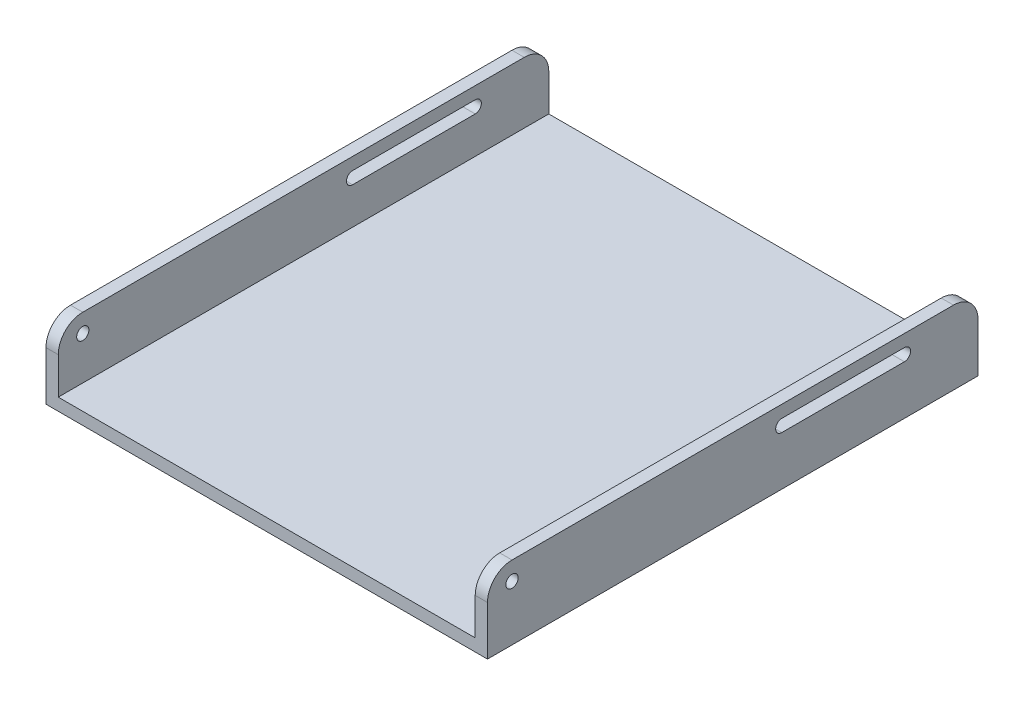
ISO-10303-21;
HEADER;
FILE_DESCRIPTION(('STEP AP214'),'2;1');
FILE_NAME('part.step','',(''),(''),'','','');
FILE_SCHEMA(('AUTOMOTIVE_DESIGN { 1 0 10303 214 1 1 1 1 }'));
ENDSEC;
DATA;
#1=APPLICATION_CONTEXT('core data for automotive mechanical design processes');
#2=APPLICATION_PROTOCOL_DEFINITION('international standard','automotive_design',2000,#1);
#3=PRODUCT_CONTEXT('',#1,'mechanical');
#4=PRODUCT('Part','Part','',(#3));
#5=PRODUCT_RELATED_PRODUCT_CATEGORY('part','',(#4));
#6=PRODUCT_DEFINITION_FORMATION('','',#4);
#7=PRODUCT_DEFINITION_CONTEXT('part definition',#1,'design');
#8=PRODUCT_DEFINITION('design','',#6,#7);
#9=PRODUCT_DEFINITION_SHAPE('','',#8);
#10=(LENGTH_UNIT() NAMED_UNIT(*) SI_UNIT(.MILLI.,.METRE.));
#11=(NAMED_UNIT(*) PLANE_ANGLE_UNIT() SI_UNIT($,.RADIAN.));
#12=(NAMED_UNIT(*) SI_UNIT($,.STERADIAN.) SOLID_ANGLE_UNIT());
#13=UNCERTAINTY_MEASURE_WITH_UNIT(LENGTH_MEASURE(1.E-05),#10,'distance_accuracy_value','');
#14=(GEOMETRIC_REPRESENTATION_CONTEXT(3) GLOBAL_UNCERTAINTY_ASSIGNED_CONTEXT((#13)) GLOBAL_UNIT_ASSIGNED_CONTEXT((#10,
#11,#12)) REPRESENTATION_CONTEXT('',''));
#15=CARTESIAN_POINT('',(0.,0.,0.));
#16=DIRECTION('',(0.,0.,1.));
#17=DIRECTION('',(1.,0.,0.));
#18=AXIS2_PLACEMENT_3D('',#15,#16,#17);
#19=CARTESIAN_POINT('',(-140.,0.,200.));
#20=DIRECTION('',(-1.,0.,0.));
#21=DIRECTION('',(0.,0.,1.));
#22=AXIS2_PLACEMENT_3D('',#19,#20,#21);
#23=PLANE('',#22);
#24=CARTESIAN_POINT('',(-140.,45.,180.));
#25=DIRECTION('',(-1.,0.,0.));
#26=DIRECTION('',(0.,0.,1.));
#27=AXIS2_PLACEMENT_3D('',#24,#25,#26);
#28=CIRCLE('',#27,4.99999999999999);
#29=CARTESIAN_POINT('',(-140.,45.,185.));
#30=VERTEX_POINT('',#29);
#31=EDGE_CURVE('E586',#30,#30,#28,.T.);
#32=ORIENTED_EDGE('',*,*,#31,.T.);
#33=EDGE_LOOP('',(#32));
#34=FACE_BOUND('',#33,.T.);
#35=DIRECTION('',(0.,0.,1.));
#36=VECTOR('',#35,1.);
#37=CARTESIAN_POINT('',(-140.,40.,200.));
#38=LINE('',#37,#36);
#39=CARTESIAN_POINT('',(-140.,40.,-140.));
#40=VERTEX_POINT('',#39);
#41=CARTESIAN_POINT('',(-140.,40.,-40.));
#42=VERTEX_POINT('',#41);
#43=EDGE_CURVE('E215',#40,#42,#38,.T.);
#44=ORIENTED_EDGE('',*,*,#43,.T.);
#45=CARTESIAN_POINT('',(-140.,45.,-40.));
#46=DIRECTION('',(-1.,0.,0.));
#47=DIRECTION('',(0.,0.,1.));
#48=AXIS2_PLACEMENT_3D('',#45,#46,#47);
#49=CIRCLE('',#48,5.);
#50=CARTESIAN_POINT('',(-140.,50.,-40.));
#51=VERTEX_POINT('',#50);
#52=EDGE_CURVE('E231',#42,#51,#49,.T.);
#53=ORIENTED_EDGE('',*,*,#52,.T.);
#54=DIRECTION('',(0.,0.,-1.));
#55=VECTOR('',#54,1.);
#56=CARTESIAN_POINT('',(-140.,50.,200.));
#57=LINE('',#56,#55);
#58=CARTESIAN_POINT('',(-140.,50.,-140.));
#59=VERTEX_POINT('',#58);
#60=EDGE_CURVE('E226',#51,#59,#57,.T.);
#61=ORIENTED_EDGE('',*,*,#60,.T.);
#62=CARTESIAN_POINT('',(-140.,45.,-140.));
#63=DIRECTION('',(-1.,0.,0.));
#64=DIRECTION('',(0.,0.,1.));
#65=AXIS2_PLACEMENT_3D('',#62,#63,#64);
#66=CIRCLE('',#65,5.);
#67=EDGE_CURVE('E221',#59,#40,#66,.T.);
#68=ORIENTED_EDGE('',*,*,#67,.T.);
#69=EDGE_LOOP('',(#44,#53,#61,#68));
#70=FACE_BOUND('',#69,.T.);
#71=DIRECTION('',(0.,0.,-1.));
#72=VECTOR('',#71,1.);
#73=CARTESIAN_POINT('',(-140.,60.,200.));
#74=LINE('',#73,#72);
#75=CARTESIAN_POINT('',(-140.,60.,180.));
#76=VERTEX_POINT('',#75);
#77=CARTESIAN_POINT('',(-140.,60.,-180.));
#78=VERTEX_POINT('',#77);
#79=EDGE_CURVE('E283',#76,#78,#74,.T.);
#80=ORIENTED_EDGE('',*,*,#79,.F.);
#81=CARTESIAN_POINT('',(-140.,40.,180.));
#82=DIRECTION('',(-1.,0.,0.));
#83=DIRECTION('',(0.,0.,1.));
#84=AXIS2_PLACEMENT_3D('',#81,#82,#83);
#85=CIRCLE('',#84,20.);
#86=CARTESIAN_POINT('',(-140.,40.,200.));
#87=VERTEX_POINT('',#86);
#88=EDGE_CURVE('E302',#76,#87,#85,.F.);
#89=ORIENTED_EDGE('',*,*,#88,.T.);
#90=DIRECTION('',(0.,1.,0.));
#91=VECTOR('',#90,1.);
#92=CARTESIAN_POINT('',(-140.,0.,200.));
#93=LINE('',#92,#91);
#94=CARTESIAN_POINT('',(-140.,10.,200.));
#95=VERTEX_POINT('',#94);
#96=EDGE_CURVE('E235',#95,#87,#93,.T.);
#97=ORIENTED_EDGE('',*,*,#96,.F.);
#98=DIRECTION('',(0.,0.,-1.));
#99=VECTOR('',#98,1.);
#100=CARTESIAN_POINT('',(-140.,10.,200.));
#101=LINE('',#100,#99);
#102=CARTESIAN_POINT('',(-140.,10.,-200.));
#103=VERTEX_POINT('',#102);
#104=EDGE_CURVE('E251',#95,#103,#101,.T.);
#105=ORIENTED_EDGE('',*,*,#104,.T.);
#106=DIRECTION('',(0.,1.,0.));
#107=VECTOR('',#106,1.);
#108=CARTESIAN_POINT('',(-140.,0.,-200.));
#109=LINE('',#108,#107);
#110=CARTESIAN_POINT('',(-140.,40.,-200.));
#111=VERTEX_POINT('',#110);
#112=EDGE_CURVE('E234',#103,#111,#109,.T.);
#113=ORIENTED_EDGE('',*,*,#112,.T.);
#114=CARTESIAN_POINT('',(-140.,40.,-180.));
#115=DIRECTION('',(-1.,0.,0.));
#116=DIRECTION('',(0.,0.,1.));
#117=AXIS2_PLACEMENT_3D('',#114,#115,#116);
#118=CIRCLE('',#117,20.);
#119=EDGE_CURVE('E300',#111,#78,#118,.F.);
#120=ORIENTED_EDGE('',*,*,#119,.T.);
#121=EDGE_LOOP('',(#80,#89,#97,#105,#113,#120));
#122=FACE_BOUND('',#121,.T.);
#123=ADVANCED_FACE('F36',(#34,#70,#122),#23,.F.);
#124=CARTESIAN_POINT('',(-150.,60.,200.));
#125=DIRECTION('',(0.,1.,0.));
#126=DIRECTION('',(0.,0.,1.));
#127=AXIS2_PLACEMENT_3D('',#124,#125,#126);
#128=PLANE('',#127);
#129=DIRECTION('',(0.,0.,-1.));
#130=VECTOR('',#129,1.);
#131=CARTESIAN_POINT('',(-150.,60.,200.));
#132=LINE('',#131,#130);
#133=CARTESIAN_POINT('',(-150.,60.,180.));
#134=VERTEX_POINT('',#133);
#135=CARTESIAN_POINT('',(-150.,60.,-180.));
#136=VERTEX_POINT('',#135);
#137=EDGE_CURVE('E280',#134,#136,#132,.T.);
#138=ORIENTED_EDGE('',*,*,#137,.F.);
#139=DIRECTION('',(1.,0.,0.));
#140=VECTOR('',#139,1.);
#141=CARTESIAN_POINT('',(-140.,60.,180.));
#142=LINE('',#141,#140);
#143=EDGE_CURVE('E297',#134,#76,#142,.T.);
#144=ORIENTED_EDGE('',*,*,#143,.T.);
#145=ORIENTED_EDGE('',*,*,#79,.T.);
#146=DIRECTION('',(1.,0.,0.));
#147=VECTOR('',#146,1.);
#148=CARTESIAN_POINT('',(-150.,60.,-180.));
#149=LINE('',#148,#147);
#150=EDGE_CURVE('E295',#78,#136,#149,.F.);
#151=ORIENTED_EDGE('',*,*,#150,.T.);
#152=EDGE_LOOP('',(#138,#144,#145,#151));
#153=FACE_BOUND('',#152,.T.);
#154=ADVANCED_FACE('F362',(#153),#128,.T.);
#155=CARTESIAN_POINT('',(-150.,0.,200.));
#156=DIRECTION('',(-1.,0.,0.));
#157=DIRECTION('',(0.,0.,1.));
#158=AXIS2_PLACEMENT_3D('',#155,#156,#157);
#159=PLANE('',#158);
#160=CARTESIAN_POINT('',(-150.,45.,180.));
#161=DIRECTION('',(-1.,0.,0.));
#162=DIRECTION('',(0.,0.,1.));
#163=AXIS2_PLACEMENT_3D('',#160,#161,#162);
#164=CIRCLE('',#163,4.99999999999999);
#165=CARTESIAN_POINT('',(-150.,45.,185.));
#166=VERTEX_POINT('',#165);
#167=EDGE_CURVE('E589',#166,#166,#164,.T.);
#168=ORIENTED_EDGE('',*,*,#167,.F.);
#169=EDGE_LOOP('',(#168));
#170=FACE_BOUND('',#169,.T.);
#171=CARTESIAN_POINT('',(-150.,45.,-40.));
#172=DIRECTION('',(-1.,0.,0.));
#173=DIRECTION('',(0.,0.,1.));
#174=AXIS2_PLACEMENT_3D('',#171,#172,#173);
#175=CIRCLE('',#174,5.);
#176=CARTESIAN_POINT('',(-150.,40.,-40.));
#177=VERTEX_POINT('',#176);
#178=CARTESIAN_POINT('',(-150.,50.,-40.));
#179=VERTEX_POINT('',#178);
#180=EDGE_CURVE('E229',#177,#179,#175,.T.);
#181=ORIENTED_EDGE('',*,*,#180,.F.);
#182=DIRECTION('',(0.,0.,1.));
#183=VECTOR('',#182,1.);
#184=CARTESIAN_POINT('',(-150.,40.,200.));
#185=LINE('',#184,#183);
#186=CARTESIAN_POINT('',(-150.,40.,-140.));
#187=VERTEX_POINT('',#186);
#188=EDGE_CURVE('E213',#187,#177,#185,.T.);
#189=ORIENTED_EDGE('',*,*,#188,.F.);
#190=CARTESIAN_POINT('',(-150.,45.,-140.));
#191=DIRECTION('',(-1.,0.,0.));
#192=DIRECTION('',(0.,0.,1.));
#193=AXIS2_PLACEMENT_3D('',#190,#191,#192);
#194=CIRCLE('',#193,5.);
#195=CARTESIAN_POINT('',(-150.,50.,-140.));
#196=VERTEX_POINT('',#195);
#197=EDGE_CURVE('E218',#196,#187,#194,.T.);
#198=ORIENTED_EDGE('',*,*,#197,.F.);
#199=DIRECTION('',(0.,0.,-1.));
#200=VECTOR('',#199,1.);
#201=CARTESIAN_POINT('',(-150.,50.,200.));
#202=LINE('',#201,#200);
#203=EDGE_CURVE('E224',#179,#196,#202,.T.);
#204=ORIENTED_EDGE('',*,*,#203,.F.);
#205=EDGE_LOOP('',(#181,#189,#198,#204));
#206=FACE_BOUND('',#205,.T.);
#207=DIRECTION('',(0.,1.,0.));
#208=VECTOR('',#207,1.);
#209=CARTESIAN_POINT('',(-150.,0.,200.));
#210=LINE('',#209,#208);
#211=CARTESIAN_POINT('',(-150.,0.,200.));
#212=VERTEX_POINT('',#211);
#213=CARTESIAN_POINT('',(-150.,40.,200.));
#214=VERTEX_POINT('',#213);
#215=EDGE_CURVE('E238',#212,#214,#210,.T.);
#216=ORIENTED_EDGE('',*,*,#215,.T.);
#217=CARTESIAN_POINT('',(-150.,40.,180.));
#218=DIRECTION('',(-1.,0.,0.));
#219=DIRECTION('',(0.,0.,1.));
#220=AXIS2_PLACEMENT_3D('',#217,#218,#219);
#221=CIRCLE('',#220,20.);
#222=EDGE_CURVE('E310',#214,#134,#221,.T.);
#223=ORIENTED_EDGE('',*,*,#222,.T.);
#224=ORIENTED_EDGE('',*,*,#137,.T.);
#225=CARTESIAN_POINT('',(-150.,40.,-180.));
#226=DIRECTION('',(-1.,0.,0.));
#227=DIRECTION('',(0.,0.,1.));
#228=AXIS2_PLACEMENT_3D('',#225,#226,#227);
#229=CIRCLE('',#228,20.);
#230=CARTESIAN_POINT('',(-150.,40.,-200.));
#231=VERTEX_POINT('',#230);
#232=EDGE_CURVE('E308',#136,#231,#229,.T.);
#233=ORIENTED_EDGE('',*,*,#232,.T.);
#234=DIRECTION('',(0.,1.,0.));
#235=VECTOR('',#234,1.);
#236=CARTESIAN_POINT('',(-150.,0.,-200.));
#237=LINE('',#236,#235);
#238=CARTESIAN_POINT('',(-150.,0.,-200.));
#239=VERTEX_POINT('',#238);
#240=EDGE_CURVE('E254',#239,#231,#237,.T.);
#241=ORIENTED_EDGE('',*,*,#240,.F.);
#242=DIRECTION('',(0.,0.,-1.));
#243=VECTOR('',#242,1.);
#244=CARTESIAN_POINT('',(-150.,0.,200.));
#245=LINE('',#244,#243);
#246=EDGE_CURVE('E278',#212,#239,#245,.T.);
#247=ORIENTED_EDGE('',*,*,#246,.F.);
#248=EDGE_LOOP('',(#216,#223,#224,#233,#241,#247));
#249=FACE_BOUND('',#248,.T.);
#250=ADVANCED_FACE('F366',(#170,#206,#249),#159,.T.);
#251=CARTESIAN_POINT('',(-150.,0.,200.));
#252=DIRECTION('',(0.,-1.,0.));
#253=DIRECTION('',(0.,0.,-1.));
#254=AXIS2_PLACEMENT_3D('',#251,#252,#253);
#255=PLANE('',#254);
#256=DIRECTION('',(-1.,0.,0.));
#257=VECTOR('',#256,1.);
#258=CARTESIAN_POINT('',(-150.,0.,-200.));
#259=LINE('',#258,#257);
#260=CARTESIAN_POINT('',(210.,0.,-200.));
#261=VERTEX_POINT('',#260);
#262=EDGE_CURVE('E257',#261,#239,#259,.T.);
#263=ORIENTED_EDGE('',*,*,#262,.F.);
#264=DIRECTION('',(0.,0.,-1.));
#265=VECTOR('',#264,1.);
#266=CARTESIAN_POINT('',(210.,0.,200.));
#267=LINE('',#266,#265);
#268=CARTESIAN_POINT('',(210.,0.,200.));
#269=VERTEX_POINT('',#268);
#270=EDGE_CURVE('E275',#269,#261,#267,.T.);
#271=ORIENTED_EDGE('',*,*,#270,.F.);
#272=DIRECTION('',(-1.,0.,0.));
#273=VECTOR('',#272,1.);
#274=CARTESIAN_POINT('',(-150.,0.,200.));
#275=LINE('',#274,#273);
#276=EDGE_CURVE('E242',#269,#212,#275,.T.);
#277=ORIENTED_EDGE('',*,*,#276,.T.);
#278=ORIENTED_EDGE('',*,*,#246,.T.);
#279=EDGE_LOOP('',(#263,#271,#277,#278));
#280=FACE_BOUND('',#279,.T.);
#281=ADVANCED_FACE('F373',(#280),#255,.T.);
#282=CARTESIAN_POINT('',(210.,0.,200.));
#283=DIRECTION('',(1.,0.,0.));
#284=DIRECTION('',(0.,0.,-1.));
#285=AXIS2_PLACEMENT_3D('',#282,#283,#284);
#286=PLANE('',#285);
#287=CARTESIAN_POINT('',(210.,45.,180.));
#288=DIRECTION('',(-1.,0.,0.));
#289=DIRECTION('',(0.,0.,1.));
#290=AXIS2_PLACEMENT_3D('',#287,#288,#289);
#291=CIRCLE('',#290,4.99999999999999);
#292=CARTESIAN_POINT('',(210.,45.,185.));
#293=VERTEX_POINT('',#292);
#294=EDGE_CURVE('E592',#293,#293,#291,.T.);
#295=ORIENTED_EDGE('',*,*,#294,.T.);
#296=EDGE_LOOP('',(#295));
#297=FACE_BOUND('',#296,.T.);
#298=CARTESIAN_POINT('',(210.,45.,-40.));
#299=DIRECTION('',(1.,0.,0.));
#300=DIRECTION('',(0.,0.,-1.));
#301=AXIS2_PLACEMENT_3D('',#298,#299,#300);
#302=CIRCLE('',#301,5.);
#303=CARTESIAN_POINT('',(210.,50.,-40.));
#304=VERTEX_POINT('',#303);
#305=CARTESIAN_POINT('',(210.,40.,-40.));
#306=VERTEX_POINT('',#305);
#307=EDGE_CURVE('E197',#304,#306,#302,.T.);
#308=ORIENTED_EDGE('',*,*,#307,.F.);
#309=DIRECTION('',(0.,0.,1.));
#310=VECTOR('',#309,1.);
#311=CARTESIAN_POINT('',(210.,50.,-40.));
#312=LINE('',#311,#310);
#313=CARTESIAN_POINT('',(210.,50.,-140.));
#314=VERTEX_POINT('',#313);
#315=EDGE_CURVE('E201',#314,#304,#312,.T.);
#316=ORIENTED_EDGE('',*,*,#315,.F.);
#317=CARTESIAN_POINT('',(210.,45.,-140.));
#318=DIRECTION('',(1.,0.,0.));
#319=DIRECTION('',(0.,0.,-1.));
#320=AXIS2_PLACEMENT_3D('',#317,#318,#319);
#321=CIRCLE('',#320,5.);
#322=CARTESIAN_POINT('',(210.,40.,-140.));
#323=VERTEX_POINT('',#322);
#324=EDGE_CURVE('E180',#323,#314,#321,.T.);
#325=ORIENTED_EDGE('',*,*,#324,.F.);
#326=DIRECTION('',(0.,0.,-1.));
#327=VECTOR('',#326,1.);
#328=CARTESIAN_POINT('',(210.,40.,-40.));
#329=LINE('',#328,#327);
#330=EDGE_CURVE('E191',#306,#323,#329,.T.);
#331=ORIENTED_EDGE('',*,*,#330,.F.);
#332=EDGE_LOOP('',(#308,#316,#325,#331));
#333=FACE_BOUND('',#332,.T.);
#334=DIRECTION('',(0.,0.,-1.));
#335=VECTOR('',#334,1.);
#336=CARTESIAN_POINT('',(210.,60.,200.));
#337=LINE('',#336,#335);
#338=CARTESIAN_POINT('',(210.,60.,180.));
#339=VERTEX_POINT('',#338);
#340=CARTESIAN_POINT('',(210.,60.,-180.));
#341=VERTEX_POINT('',#340);
#342=EDGE_CURVE('E273',#339,#341,#337,.T.);
#343=ORIENTED_EDGE('',*,*,#342,.F.);
#344=CARTESIAN_POINT('',(210.,40.,180.));
#345=DIRECTION('',(1.,0.,0.));
#346=DIRECTION('',(0.,0.,-1.));
#347=AXIS2_PLACEMENT_3D('',#344,#345,#346);
#348=CIRCLE('',#347,20.);
#349=CARTESIAN_POINT('',(210.,40.,200.));
#350=VERTEX_POINT('',#349);
#351=EDGE_CURVE('E60',#339,#350,#348,.T.);
#352=ORIENTED_EDGE('',*,*,#351,.T.);
#353=DIRECTION('',(0.,-1.,0.));
#354=VECTOR('',#353,1.);
#355=CARTESIAN_POINT('',(210.,0.,200.));
#356=LINE('',#355,#354);
#357=EDGE_CURVE('E245',#350,#269,#356,.T.);
#358=ORIENTED_EDGE('',*,*,#357,.T.);
#359=ORIENTED_EDGE('',*,*,#270,.T.);
#360=DIRECTION('',(0.,-1.,0.));
#361=VECTOR('',#360,1.);
#362=CARTESIAN_POINT('',(210.,0.,-200.));
#363=LINE('',#362,#361);
#364=CARTESIAN_POINT('',(210.,40.,-200.));
#365=VERTEX_POINT('',#364);
#366=EDGE_CURVE('E260',#365,#261,#363,.T.);
#367=ORIENTED_EDGE('',*,*,#366,.F.);
#368=CARTESIAN_POINT('',(210.,40.,-180.));
#369=DIRECTION('',(1.,0.,0.));
#370=DIRECTION('',(0.,0.,-1.));
#371=AXIS2_PLACEMENT_3D('',#368,#369,#370);
#372=CIRCLE('',#371,20.);
#373=EDGE_CURVE('E52',#365,#341,#372,.T.);
#374=ORIENTED_EDGE('',*,*,#373,.T.);
#375=EDGE_LOOP('',(#343,#352,#358,#359,#367,#374));
#376=FACE_BOUND('',#375,.T.);
#377=ADVANCED_FACE('F199',(#297,#333,#376),#286,.T.);
#378=CARTESIAN_POINT('',(200.,60.,200.));
#379=DIRECTION('',(0.,1.,0.));
#380=DIRECTION('',(0.,0.,1.));
#381=AXIS2_PLACEMENT_3D('',#378,#379,#380);
#382=PLANE('',#381);
#383=DIRECTION('',(0.,0.,-1.));
#384=VECTOR('',#383,1.);
#385=CARTESIAN_POINT('',(200.,60.,200.));
#386=LINE('',#385,#384);
#387=CARTESIAN_POINT('',(200.,60.,180.));
#388=VERTEX_POINT('',#387);
#389=CARTESIAN_POINT('',(200.,60.,-180.));
#390=VERTEX_POINT('',#389);
#391=EDGE_CURVE('E270',#388,#390,#386,.T.);
#392=ORIENTED_EDGE('',*,*,#391,.F.);
#393=DIRECTION('',(1.,0.,0.));
#394=VECTOR('',#393,1.);
#395=CARTESIAN_POINT('',(210.,60.,180.));
#396=LINE('',#395,#394);
#397=EDGE_CURVE('E320',#388,#339,#396,.T.);
#398=ORIENTED_EDGE('',*,*,#397,.T.);
#399=ORIENTED_EDGE('',*,*,#342,.T.);
#400=DIRECTION('',(1.,0.,0.));
#401=VECTOR('',#400,1.);
#402=CARTESIAN_POINT('',(200.,60.,-180.));
#403=LINE('',#402,#401);
#404=EDGE_CURVE('E318',#341,#390,#403,.F.);
#405=ORIENTED_EDGE('',*,*,#404,.T.);
#406=EDGE_LOOP('',(#392,#398,#399,#405));
#407=FACE_BOUND('',#406,.T.);
#408=ADVANCED_FACE('F339',(#407),#382,.T.);
#409=CARTESIAN_POINT('',(200.,0.,200.));
#410=DIRECTION('',(1.,0.,0.));
#411=DIRECTION('',(0.,0.,-1.));
#412=AXIS2_PLACEMENT_3D('',#409,#410,#411);
#413=PLANE('',#412);
#414=CARTESIAN_POINT('',(200.,45.,180.));
#415=DIRECTION('',(1.,0.,0.));
#416=DIRECTION('',(0.,0.,-1.));
#417=AXIS2_PLACEMENT_3D('',#414,#415,#416);
#418=CIRCLE('',#417,4.99999999999999);
#419=CARTESIAN_POINT('',(200.,45.,185.));
#420=VERTEX_POINT('',#419);
#421=EDGE_CURVE('E40',#420,#420,#418,.T.);
#422=ORIENTED_EDGE('',*,*,#421,.T.);
#423=EDGE_LOOP('',(#422));
#424=FACE_BOUND('',#423,.T.);
#425=DIRECTION('',(0.,0.,1.));
#426=VECTOR('',#425,1.);
#427=CARTESIAN_POINT('',(200.,50.,200.));
#428=LINE('',#427,#426);
#429=CARTESIAN_POINT('',(200.,50.,-140.));
#430=VERTEX_POINT('',#429);
#431=CARTESIAN_POINT('',(200.,50.,-40.));
#432=VERTEX_POINT('',#431);
#433=EDGE_CURVE('E289',#430,#432,#428,.T.);
#434=ORIENTED_EDGE('',*,*,#433,.T.);
#435=CARTESIAN_POINT('',(200.,45.,-40.));
#436=DIRECTION('',(1.,0.,0.));
#437=DIRECTION('',(0.,0.,-1.));
#438=AXIS2_PLACEMENT_3D('',#435,#436,#437);
#439=CIRCLE('',#438,5.);
#440=CARTESIAN_POINT('',(200.,40.,-40.));
#441=VERTEX_POINT('',#440);
#442=EDGE_CURVE('E292',#432,#441,#439,.T.);
#443=ORIENTED_EDGE('',*,*,#442,.T.);
#444=DIRECTION('',(0.,0.,-1.));
#445=VECTOR('',#444,1.);
#446=CARTESIAN_POINT('',(200.,40.,200.));
#447=LINE('',#446,#445);
#448=CARTESIAN_POINT('',(200.,40.,-140.));
#449=VERTEX_POINT('',#448);
#450=EDGE_CURVE('E286',#441,#449,#447,.T.);
#451=ORIENTED_EDGE('',*,*,#450,.T.);
#452=CARTESIAN_POINT('',(200.,45.,-140.));
#453=DIRECTION('',(1.,0.,0.));
#454=DIRECTION('',(0.,0.,-1.));
#455=AXIS2_PLACEMENT_3D('',#452,#453,#454);
#456=CIRCLE('',#455,5.);
#457=EDGE_CURVE('E183',#449,#430,#456,.T.);
#458=ORIENTED_EDGE('',*,*,#457,.T.);
#459=EDGE_LOOP('',(#434,#443,#451,#458));
#460=FACE_BOUND('',#459,.T.);
#461=DIRECTION('',(0.,1.,0.));
#462=VECTOR('',#461,1.);
#463=CARTESIAN_POINT('',(200.,0.,200.));
#464=LINE('',#463,#462);
#465=CARTESIAN_POINT('',(200.,40.,200.));
#466=VERTEX_POINT('',#465);
#467=CARTESIAN_POINT('',(200.,10.,200.));
#468=VERTEX_POINT('',#467);
#469=EDGE_CURVE('E247',#466,#468,#464,.F.);
#470=ORIENTED_EDGE('',*,*,#469,.F.);
#471=CARTESIAN_POINT('',(200.,40.,180.));
#472=DIRECTION('',(1.,0.,0.));
#473=DIRECTION('',(0.,0.,-1.));
#474=AXIS2_PLACEMENT_3D('',#471,#472,#473);
#475=CIRCLE('',#474,20.);
#476=EDGE_CURVE('E11',#466,#388,#475,.F.);
#477=ORIENTED_EDGE('',*,*,#476,.T.);
#478=ORIENTED_EDGE('',*,*,#391,.T.);
#479=CARTESIAN_POINT('',(200.,40.,-180.));
#480=DIRECTION('',(1.,0.,0.));
#481=DIRECTION('',(0.,0.,-1.));
#482=AXIS2_PLACEMENT_3D('',#479,#480,#481);
#483=CIRCLE('',#482,20.);
#484=CARTESIAN_POINT('',(200.,40.,-200.));
#485=VERTEX_POINT('',#484);
#486=EDGE_CURVE('E45',#390,#485,#483,.F.);
#487=ORIENTED_EDGE('',*,*,#486,.T.);
#488=DIRECTION('',(0.,1.,0.));
#489=VECTOR('',#488,1.);
#490=CARTESIAN_POINT('',(200.,0.,-200.));
#491=LINE('',#490,#489);
#492=CARTESIAN_POINT('',(200.,10.,-200.));
#493=VERTEX_POINT('',#492);
#494=EDGE_CURVE('E262',#485,#493,#491,.F.);
#495=ORIENTED_EDGE('',*,*,#494,.T.);
#496=DIRECTION('',(0.,0.,-1.));
#497=VECTOR('',#496,1.);
#498=CARTESIAN_POINT('',(200.,10.,200.));
#499=LINE('',#498,#497);
#500=EDGE_CURVE('E267',#468,#493,#499,.T.);
#501=ORIENTED_EDGE('',*,*,#500,.F.);
#502=EDGE_LOOP('',(#470,#477,#478,#487,#495,#501));
#503=FACE_BOUND('',#502,.T.);
#504=ADVANCED_FACE('F328',(#424,#460,#503),#413,.F.);
#505=CARTESIAN_POINT('',(-150.,10.,200.));
#506=DIRECTION('',(0.,-1.,0.));
#507=DIRECTION('',(0.,0.,-1.));
#508=AXIS2_PLACEMENT_3D('',#505,#506,#507);
#509=PLANE('',#508);
#510=DIRECTION('',(1.,0.,0.));
#511=VECTOR('',#510,1.);
#512=CARTESIAN_POINT('',(-150.,10.,-200.));
#513=LINE('',#512,#511);
#514=EDGE_CURVE('E239',#493,#103,#513,.F.);
#515=ORIENTED_EDGE('',*,*,#514,.T.);
#516=ORIENTED_EDGE('',*,*,#104,.F.);
#517=DIRECTION('',(1.,0.,0.));
#518=VECTOR('',#517,1.);
#519=CARTESIAN_POINT('',(-150.,10.,200.));
#520=LINE('',#519,#518);
#521=EDGE_CURVE('E249',#468,#95,#520,.F.);
#522=ORIENTED_EDGE('',*,*,#521,.F.);
#523=ORIENTED_EDGE('',*,*,#500,.T.);
#524=EDGE_LOOP('',(#515,#516,#522,#523));
#525=FACE_BOUND('',#524,.T.);
#526=ADVANCED_FACE('F353',(#525),#509,.F.);
#527=CARTESIAN_POINT('',(0.,0.,200.));
#528=DIRECTION('',(0.,0.,-1.));
#529=DIRECTION('',(-1.,0.,0.));
#530=AXIS2_PLACEMENT_3D('',#527,#528,#529);
#531=PLANE('',#530);
#532=ORIENTED_EDGE('',*,*,#96,.T.);
#533=DIRECTION('',(1.,0.,0.));
#534=VECTOR('',#533,1.);
#535=CARTESIAN_POINT('',(-150.,40.,200.));
#536=LINE('',#535,#534);
#537=EDGE_CURVE('E306',#87,#214,#536,.F.);
#538=ORIENTED_EDGE('',*,*,#537,.T.);
#539=ORIENTED_EDGE('',*,*,#215,.F.);
#540=ORIENTED_EDGE('',*,*,#276,.F.);
#541=ORIENTED_EDGE('',*,*,#357,.F.);
#542=DIRECTION('',(1.,0.,0.));
#543=VECTOR('',#542,1.);
#544=CARTESIAN_POINT('',(200.,40.,200.));
#545=LINE('',#544,#543);
#546=EDGE_CURVE('E304',#350,#466,#545,.F.);
#547=ORIENTED_EDGE('',*,*,#546,.T.);
#548=ORIENTED_EDGE('',*,*,#469,.T.);
#549=ORIENTED_EDGE('',*,*,#521,.T.);
#550=EDGE_LOOP('',(#532,#538,#539,#540,#541,#547,#548,#549));
#551=FACE_BOUND('',#550,.T.);
#552=ADVANCED_FACE('F344',(#551),#531,.F.);
#553=CARTESIAN_POINT('',(0.,0.,-200.));
#554=DIRECTION('',(0.,0.,-1.));
#555=DIRECTION('',(-1.,0.,0.));
#556=AXIS2_PLACEMENT_3D('',#553,#554,#555);
#557=PLANE('',#556);
#558=ORIENTED_EDGE('',*,*,#240,.T.);
#559=DIRECTION('',(1.,0.,0.));
#560=VECTOR('',#559,1.);
#561=CARTESIAN_POINT('',(0.,40.,-200.));
#562=LINE('',#561,#560);
#563=EDGE_CURVE('E315',#231,#111,#562,.T.);
#564=ORIENTED_EDGE('',*,*,#563,.T.);
#565=ORIENTED_EDGE('',*,*,#112,.F.);
#566=ORIENTED_EDGE('',*,*,#514,.F.);
#567=ORIENTED_EDGE('',*,*,#494,.F.);
#568=DIRECTION('',(1.,0.,0.));
#569=VECTOR('',#568,1.);
#570=CARTESIAN_POINT('',(0.,40.,-200.));
#571=LINE('',#570,#569);
#572=EDGE_CURVE('E312',#485,#365,#571,.T.);
#573=ORIENTED_EDGE('',*,*,#572,.T.);
#574=ORIENTED_EDGE('',*,*,#366,.T.);
#575=ORIENTED_EDGE('',*,*,#262,.T.);
#576=EDGE_LOOP('',(#558,#564,#565,#566,#567,#573,#574,#575));
#577=FACE_BOUND('',#576,.T.);
#578=ADVANCED_FACE('F336',(#577),#557,.T.);
#579=CARTESIAN_POINT('',(-154.,40.,-40.));
#580=DIRECTION('',(0.,-1.,0.));
#581=DIRECTION('',(0.,0.,-1.));
#582=AXIS2_PLACEMENT_3D('',#579,#580,#581);
#583=PLANE('',#582);
#584=DIRECTION('',(1.,0.,0.));
#585=VECTOR('',#584,1.);
#586=CARTESIAN_POINT('',(-154.,40.,-40.));
#587=LINE('',#586,#585);
#588=EDGE_CURVE('E194',#441,#306,#587,.T.);
#589=ORIENTED_EDGE('',*,*,#588,.T.);
#590=ORIENTED_EDGE('',*,*,#330,.T.);
#591=DIRECTION('',(1.,0.,0.));
#592=VECTOR('',#591,1.);
#593=CARTESIAN_POINT('',(-154.,40.,-140.));
#594=LINE('',#593,#592);
#595=EDGE_CURVE('E175',#449,#323,#594,.T.);
#596=ORIENTED_EDGE('',*,*,#595,.F.);
#597=ORIENTED_EDGE('',*,*,#450,.F.);
#598=EDGE_LOOP('',(#589,#590,#596,#597));
#599=FACE_BOUND('',#598,.T.);
#600=ADVANCED_FACE('F192',(#599),#583,.F.);
#601=CARTESIAN_POINT('',(-154.,45.,-140.));
#602=DIRECTION('',(1.,0.,0.));
#603=DIRECTION('',(0.,0.,-1.));
#604=AXIS2_PLACEMENT_3D('',#601,#602,#603);
#605=CYLINDRICAL_SURFACE('',#604,5.);
#606=ORIENTED_EDGE('',*,*,#595,.T.);
#607=ORIENTED_EDGE('',*,*,#324,.T.);
#608=DIRECTION('',(1.,0.,0.));
#609=VECTOR('',#608,1.);
#610=CARTESIAN_POINT('',(-154.,50.,-140.));
#611=LINE('',#610,#609);
#612=EDGE_CURVE('E210',#430,#314,#611,.T.);
#613=ORIENTED_EDGE('',*,*,#612,.F.);
#614=ORIENTED_EDGE('',*,*,#457,.F.);
#615=EDGE_LOOP('',(#606,#607,#613,#614));
#616=FACE_BOUND('',#615,.T.);
#617=ADVANCED_FACE('F177',(#616),#605,.F.);
#618=CARTESIAN_POINT('',(-154.,50.,-40.));
#619=DIRECTION('',(0.,1.,0.));
#620=DIRECTION('',(0.,0.,1.));
#621=AXIS2_PLACEMENT_3D('',#618,#619,#620);
#622=PLANE('',#621);
#623=ORIENTED_EDGE('',*,*,#612,.T.);
#624=ORIENTED_EDGE('',*,*,#315,.T.);
#625=DIRECTION('',(1.,0.,0.));
#626=VECTOR('',#625,1.);
#627=CARTESIAN_POINT('',(-154.,50.,-40.));
#628=LINE('',#627,#626);
#629=EDGE_CURVE('E206',#432,#304,#628,.T.);
#630=ORIENTED_EDGE('',*,*,#629,.F.);
#631=ORIENTED_EDGE('',*,*,#433,.F.);
#632=EDGE_LOOP('',(#623,#624,#630,#631));
#633=FACE_BOUND('',#632,.T.);
#634=ADVANCED_FACE('F422',(#633),#622,.F.);
#635=CARTESIAN_POINT('',(-154.,45.,-40.));
#636=DIRECTION('',(1.,0.,0.));
#637=DIRECTION('',(0.,0.,-1.));
#638=AXIS2_PLACEMENT_3D('',#635,#636,#637);
#639=CYLINDRICAL_SURFACE('',#638,5.);
#640=ORIENTED_EDGE('',*,*,#629,.T.);
#641=ORIENTED_EDGE('',*,*,#307,.T.);
#642=ORIENTED_EDGE('',*,*,#588,.F.);
#643=ORIENTED_EDGE('',*,*,#442,.F.);
#644=EDGE_LOOP('',(#640,#641,#642,#643));
#645=FACE_BOUND('',#644,.T.);
#646=ADVANCED_FACE('F431',(#645),#639,.F.);
#647=EDGE_CURVE('E187',#177,#42,#587,.T.);
#648=ORIENTED_EDGE('',*,*,#647,.F.);
#649=ORIENTED_EDGE('',*,*,#180,.T.);
#650=EDGE_CURVE('E208',#179,#51,#628,.T.);
#651=ORIENTED_EDGE('',*,*,#650,.T.);
#652=ORIENTED_EDGE('',*,*,#52,.F.);
#653=EDGE_LOOP('',(#648,#649,#651,#652));
#654=FACE_BOUND('',#653,.T.);
#655=ADVANCED_FACE('F420',(#654),#639,.F.);
#656=ORIENTED_EDGE('',*,*,#650,.F.);
#657=ORIENTED_EDGE('',*,*,#203,.T.);
#658=EDGE_CURVE('E209',#196,#59,#611,.T.);
#659=ORIENTED_EDGE('',*,*,#658,.T.);
#660=ORIENTED_EDGE('',*,*,#60,.F.);
#661=EDGE_LOOP('',(#656,#657,#659,#660));
#662=FACE_BOUND('',#661,.T.);
#663=ADVANCED_FACE('F416',(#662),#622,.F.);
#664=ORIENTED_EDGE('',*,*,#658,.F.);
#665=ORIENTED_EDGE('',*,*,#197,.T.);
#666=EDGE_CURVE('E186',#187,#40,#594,.T.);
#667=ORIENTED_EDGE('',*,*,#666,.T.);
#668=ORIENTED_EDGE('',*,*,#67,.F.);
#669=EDGE_LOOP('',(#664,#665,#667,#668));
#670=FACE_BOUND('',#669,.T.);
#671=ADVANCED_FACE('F419',(#670),#605,.F.);
#672=ORIENTED_EDGE('',*,*,#666,.F.);
#673=ORIENTED_EDGE('',*,*,#188,.T.);
#674=ORIENTED_EDGE('',*,*,#647,.T.);
#675=ORIENTED_EDGE('',*,*,#43,.F.);
#676=EDGE_LOOP('',(#672,#673,#674,#675));
#677=FACE_BOUND('',#676,.T.);
#678=ADVANCED_FACE('F396',(#677),#583,.F.);
#679=CARTESIAN_POINT('',(-150.,40.,180.));
#680=DIRECTION('',(-1.,0.,0.));
#681=DIRECTION('',(0.,0.,1.));
#682=AXIS2_PLACEMENT_3D('',#679,#680,#681);
#683=CYLINDRICAL_SURFACE('',#682,20.);
#684=ORIENTED_EDGE('',*,*,#222,.F.);
#685=ORIENTED_EDGE('',*,*,#537,.F.);
#686=ORIENTED_EDGE('',*,*,#88,.F.);
#687=ORIENTED_EDGE('',*,*,#143,.F.);
#688=EDGE_LOOP('',(#684,#685,#686,#687));
#689=FACE_BOUND('',#688,.T.);
#690=ADVANCED_FACE('F359',(#689),#683,.T.);
#691=CARTESIAN_POINT('',(0.,40.,-180.));
#692=DIRECTION('',(1.,0.,0.));
#693=DIRECTION('',(0.,0.,-1.));
#694=AXIS2_PLACEMENT_3D('',#691,#692,#693);
#695=CYLINDRICAL_SURFACE('',#694,20.);
#696=ORIENTED_EDGE('',*,*,#232,.F.);
#697=ORIENTED_EDGE('',*,*,#150,.F.);
#698=ORIENTED_EDGE('',*,*,#119,.F.);
#699=ORIENTED_EDGE('',*,*,#563,.F.);
#700=EDGE_LOOP('',(#696,#697,#698,#699));
#701=FACE_BOUND('',#700,.T.);
#702=ADVANCED_FACE('F370',(#701),#695,.T.);
#703=CARTESIAN_POINT('',(200.,40.,180.));
#704=DIRECTION('',(-1.,0.,0.));
#705=DIRECTION('',(0.,0.,1.));
#706=AXIS2_PLACEMENT_3D('',#703,#704,#705);
#707=CYLINDRICAL_SURFACE('',#706,20.);
#708=ORIENTED_EDGE('',*,*,#476,.F.);
#709=ORIENTED_EDGE('',*,*,#546,.F.);
#710=ORIENTED_EDGE('',*,*,#351,.F.);
#711=ORIENTED_EDGE('',*,*,#397,.F.);
#712=EDGE_LOOP('',(#708,#709,#710,#711));
#713=FACE_BOUND('',#712,.T.);
#714=ADVANCED_FACE('F347',(#713),#707,.T.);
#715=CARTESIAN_POINT('',(0.,40.,-180.));
#716=DIRECTION('',(1.,0.,0.));
#717=DIRECTION('',(0.,0.,-1.));
#718=AXIS2_PLACEMENT_3D('',#715,#716,#717);
#719=CYLINDRICAL_SURFACE('',#718,20.);
#720=ORIENTED_EDGE('',*,*,#486,.F.);
#721=ORIENTED_EDGE('',*,*,#404,.F.);
#722=ORIENTED_EDGE('',*,*,#373,.F.);
#723=ORIENTED_EDGE('',*,*,#572,.F.);
#724=EDGE_LOOP('',(#720,#721,#722,#723));
#725=FACE_BOUND('',#724,.T.);
#726=ADVANCED_FACE('F38',(#725),#719,.T.);
#727=CARTESIAN_POINT('',(210.,45.,180.));
#728=DIRECTION('',(-1.,0.,0.));
#729=DIRECTION('',(0.,0.,1.));
#730=AXIS2_PLACEMENT_3D('',#727,#728,#729);
#731=CYLINDRICAL_SURFACE('',#730,4.99999999999999);
#732=CARTESIAN_POINT('',(210.,45.,185.));
#733=CARTESIAN_POINT('',(209.895833333333,45.,185.));
#734=CARTESIAN_POINT('',(209.791666666667,45.,185.));
#735=CARTESIAN_POINT('',(209.583333333333,45.,185.));
#736=CARTESIAN_POINT('',(209.479166666667,45.,185.));
#737=CARTESIAN_POINT('',(209.270833333333,45.,185.));
#738=CARTESIAN_POINT('',(209.166666666667,45.,185.));
#739=CARTESIAN_POINT('',(208.958333333333,45.,185.));
#740=CARTESIAN_POINT('',(208.854166666667,45.,185.));
#741=CARTESIAN_POINT('',(208.645833333333,45.,185.));
#742=CARTESIAN_POINT('',(208.541666666667,45.,185.));
#743=CARTESIAN_POINT('',(208.333333333333,45.,185.));
#744=CARTESIAN_POINT('',(208.229166666667,45.,185.));
#745=CARTESIAN_POINT('',(208.020833333333,45.,185.));
#746=CARTESIAN_POINT('',(207.916666666667,45.,185.));
#747=CARTESIAN_POINT('',(207.708333333333,45.,185.));
#748=CARTESIAN_POINT('',(207.604166666667,45.,185.));
#749=CARTESIAN_POINT('',(207.395833333333,45.,185.));
#750=CARTESIAN_POINT('',(207.291666666667,45.,185.));
#751=CARTESIAN_POINT('',(207.083333333333,45.,185.));
#752=CARTESIAN_POINT('',(206.979166666667,45.,185.));
#753=CARTESIAN_POINT('',(206.770833333333,45.,185.));
#754=CARTESIAN_POINT('',(206.666666666667,45.,185.));
#755=CARTESIAN_POINT('',(206.458333333333,45.,185.));
#756=CARTESIAN_POINT('',(206.354166666667,45.,185.));
#757=CARTESIAN_POINT('',(206.145833333333,45.,185.));
#758=CARTESIAN_POINT('',(206.041666666667,45.,185.));
#759=CARTESIAN_POINT('',(205.833333333333,45.,185.));
#760=CARTESIAN_POINT('',(205.729166666667,45.,185.));
#761=CARTESIAN_POINT('',(205.520833333333,45.,185.));
#762=CARTESIAN_POINT('',(205.416666666667,45.,185.));
#763=CARTESIAN_POINT('',(205.208333333333,45.,185.));
#764=CARTESIAN_POINT('',(205.104166666667,45.,185.));
#765=CARTESIAN_POINT('',(204.895833333333,45.,185.));
#766=CARTESIAN_POINT('',(204.791666666667,45.,185.));
#767=CARTESIAN_POINT('',(204.583333333333,45.,185.));
#768=CARTESIAN_POINT('',(204.479166666667,45.,185.));
#769=CARTESIAN_POINT('',(204.270833333333,45.,185.));
#770=CARTESIAN_POINT('',(204.166666666667,45.,185.));
#771=CARTESIAN_POINT('',(203.958333333333,45.,185.));
#772=CARTESIAN_POINT('',(203.854166666667,45.,185.));
#773=CARTESIAN_POINT('',(203.645833333333,45.,185.));
#774=CARTESIAN_POINT('',(203.541666666667,45.,185.));
#775=CARTESIAN_POINT('',(203.333333333333,45.,185.));
#776=CARTESIAN_POINT('',(203.229166666667,45.,185.));
#777=CARTESIAN_POINT('',(203.020833333333,45.,185.));
#778=CARTESIAN_POINT('',(202.916666666667,45.,185.));
#779=CARTESIAN_POINT('',(202.708333333333,45.,185.));
#780=CARTESIAN_POINT('',(202.604166666667,45.,185.));
#781=CARTESIAN_POINT('',(202.395833333333,45.,185.));
#782=CARTESIAN_POINT('',(202.291666666667,45.,185.));
#783=CARTESIAN_POINT('',(202.083333333333,45.,185.));
#784=CARTESIAN_POINT('',(201.979166666667,45.,185.));
#785=CARTESIAN_POINT('',(201.770833333333,45.,185.));
#786=CARTESIAN_POINT('',(201.666666666667,45.,185.));
#787=CARTESIAN_POINT('',(201.458333333333,45.,185.));
#788=CARTESIAN_POINT('',(201.354166666667,45.,185.));
#789=CARTESIAN_POINT('',(201.145833333333,45.,185.));
#790=CARTESIAN_POINT('',(201.041666666667,45.,185.));
#791=CARTESIAN_POINT('',(200.833333333333,45.,185.));
#792=CARTESIAN_POINT('',(200.729166666667,45.,185.));
#793=CARTESIAN_POINT('',(200.520833333333,45.,185.));
#794=CARTESIAN_POINT('',(200.416666666667,45.,185.));
#795=CARTESIAN_POINT('',(200.208333333333,45.,185.));
#796=CARTESIAN_POINT('',(200.104166666667,45.,185.));
#797=CARTESIAN_POINT('',(200.,45.,185.));
#798=B_SPLINE_CURVE_WITH_KNOTS('',3,(#732,#733,#734,#735,#736,#737,#738,#739,#740,#741,#742,
#743,#744,#745,#746,#747,#748,#749,#750,#751,#752,#753,#754,#755,#756,#757,#758,#759,#760,#761,
#762,#763,#764,#765,#766,#767,#768,#769,#770,#771,#772,#773,#774,#775,#776,#777,#778,#779,#780,
#781,#782,#783,#784,#785,#786,#787,#788,#789,#790,#791,#792,#793,#794,#795,#796,#797),
.UNSPECIFIED.,.F.,.F.,(4,2,2,2,2,2,2,2,2,2,2,2,2,2,2,2,2,2,2,2,2,2,2,2,2,2,2,2,2,2,2,2,4),(0.,
0.312500000000021,0.625000000000014,0.937500000000008,1.25000000000003,1.56250000000002,
1.87500000000002,2.18750000000001,2.50000000000003,2.81250000000002,3.12500000000002,
3.43750000000004,3.75000000000003,4.06250000000002,4.37500000000002,4.68750000000004,
5.00000000000003,5.31250000000003,5.62500000000005,5.93750000000004,6.25000000000003,
6.56250000000003,6.87500000000005,7.18750000000004,7.50000000000003,7.81250000000003,
8.12500000000005,8.43750000000004,8.75000000000004,9.06250000000006,9.37500000000005,
9.68750000000004,10.),.UNSPECIFIED.);
#799=EDGE_CURVE('BSEAM402',#293,#420,#798,.T.);
#800=ORIENTED_EDGE('',*,*,#294,.F.);
#801=ORIENTED_EDGE('',*,*,#421,.F.);
#802=ORIENTED_EDGE('',*,*,#799,.T.);
#803=ORIENTED_EDGE('',*,*,#799,.F.);
#804=EDGE_LOOP('',(#800,#802,#801,#803));
#805=FACE_BOUND('',#804,.T.);
#806=ADVANCED_FACE('F402',(#805),#731,.F.);
#807=CARTESIAN_POINT('',(-150.,45.,185.));
#808=CARTESIAN_POINT('',(-149.895833333333,45.,185.));
#809=CARTESIAN_POINT('',(-149.791666666667,45.,185.));
#810=CARTESIAN_POINT('',(-149.583333333333,45.,185.));
#811=CARTESIAN_POINT('',(-149.479166666667,45.,185.));
#812=CARTESIAN_POINT('',(-149.270833333333,45.,185.));
#813=CARTESIAN_POINT('',(-149.166666666667,45.,185.));
#814=CARTESIAN_POINT('',(-148.958333333333,45.,185.));
#815=CARTESIAN_POINT('',(-148.854166666667,45.,185.));
#816=CARTESIAN_POINT('',(-148.645833333333,45.,185.));
#817=CARTESIAN_POINT('',(-148.541666666667,45.,185.));
#818=CARTESIAN_POINT('',(-148.333333333333,45.,185.));
#819=CARTESIAN_POINT('',(-148.229166666667,45.,185.));
#820=CARTESIAN_POINT('',(-148.020833333333,45.,185.));
#821=CARTESIAN_POINT('',(-147.916666666667,45.,185.));
#822=CARTESIAN_POINT('',(-147.708333333333,45.,185.));
#823=CARTESIAN_POINT('',(-147.604166666667,45.,185.));
#824=CARTESIAN_POINT('',(-147.395833333333,45.,185.));
#825=CARTESIAN_POINT('',(-147.291666666667,45.,185.));
#826=CARTESIAN_POINT('',(-147.083333333333,45.,185.));
#827=CARTESIAN_POINT('',(-146.979166666667,45.,185.));
#828=CARTESIAN_POINT('',(-146.770833333333,45.,185.));
#829=CARTESIAN_POINT('',(-146.666666666667,45.,185.));
#830=CARTESIAN_POINT('',(-146.458333333333,45.,185.));
#831=CARTESIAN_POINT('',(-146.354166666667,45.,185.));
#832=CARTESIAN_POINT('',(-146.145833333333,45.,185.));
#833=CARTESIAN_POINT('',(-146.041666666667,45.,185.));
#834=CARTESIAN_POINT('',(-145.833333333333,45.,185.));
#835=CARTESIAN_POINT('',(-145.729166666667,45.,185.));
#836=CARTESIAN_POINT('',(-145.520833333333,45.,185.));
#837=CARTESIAN_POINT('',(-145.416666666667,45.,185.));
#838=CARTESIAN_POINT('',(-145.208333333333,45.,185.));
#839=CARTESIAN_POINT('',(-145.104166666667,45.,185.));
#840=CARTESIAN_POINT('',(-144.895833333333,45.,185.));
#841=CARTESIAN_POINT('',(-144.791666666667,45.,185.));
#842=CARTESIAN_POINT('',(-144.583333333333,45.,185.));
#843=CARTESIAN_POINT('',(-144.479166666667,45.,185.));
#844=CARTESIAN_POINT('',(-144.270833333333,45.,185.));
#845=CARTESIAN_POINT('',(-144.166666666667,45.,185.));
#846=CARTESIAN_POINT('',(-143.958333333333,45.,185.));
#847=CARTESIAN_POINT('',(-143.854166666667,45.,185.));
#848=CARTESIAN_POINT('',(-143.645833333333,45.,185.));
#849=CARTESIAN_POINT('',(-143.541666666667,45.,185.));
#850=CARTESIAN_POINT('',(-143.333333333333,45.,185.));
#851=CARTESIAN_POINT('',(-143.229166666667,45.,185.));
#852=CARTESIAN_POINT('',(-143.020833333333,45.,185.));
#853=CARTESIAN_POINT('',(-142.916666666667,45.,185.));
#854=CARTESIAN_POINT('',(-142.708333333333,45.,185.));
#855=CARTESIAN_POINT('',(-142.604166666667,45.,185.));
#856=CARTESIAN_POINT('',(-142.395833333333,45.,185.));
#857=CARTESIAN_POINT('',(-142.291666666667,45.,185.));
#858=CARTESIAN_POINT('',(-142.083333333333,45.,185.));
#859=CARTESIAN_POINT('',(-141.979166666667,45.,185.));
#860=CARTESIAN_POINT('',(-141.770833333333,45.,185.));
#861=CARTESIAN_POINT('',(-141.666666666667,45.,185.));
#862=CARTESIAN_POINT('',(-141.458333333333,45.,185.));
#863=CARTESIAN_POINT('',(-141.354166666667,45.,185.));
#864=CARTESIAN_POINT('',(-141.145833333333,45.,185.));
#865=CARTESIAN_POINT('',(-141.041666666667,45.,185.));
#866=CARTESIAN_POINT('',(-140.833333333333,45.,185.));
#867=CARTESIAN_POINT('',(-140.729166666667,45.,185.));
#868=CARTESIAN_POINT('',(-140.520833333333,45.,185.));
#869=CARTESIAN_POINT('',(-140.416666666667,45.,185.));
#870=CARTESIAN_POINT('',(-140.208333333333,45.,185.));
#871=CARTESIAN_POINT('',(-140.104166666667,45.,185.));
#872=CARTESIAN_POINT('',(-140.,45.,185.));
#873=B_SPLINE_CURVE_WITH_KNOTS('',3,(#807,#808,#809,#810,#811,#812,#813,#814,#815,#816,#817,
#818,#819,#820,#821,#822,#823,#824,#825,#826,#827,#828,#829,#830,#831,#832,#833,#834,#835,#836,
#837,#838,#839,#840,#841,#842,#843,#844,#845,#846,#847,#848,#849,#850,#851,#852,#853,#854,#855,
#856,#857,#858,#859,#860,#861,#862,#863,#864,#865,#866,#867,#868,#869,#870,#871,#872),
.UNSPECIFIED.,.F.,.F.,(4,2,2,2,2,2,2,2,2,2,2,2,2,2,2,2,2,2,2,2,2,2,2,2,2,2,2,2,2,2,2,2,4),(0.,
0.312499999999993,0.624999999999987,0.93749999999998,1.24999999999997,1.56250000000002,
1.87500000000002,2.18750000000001,2.5,2.8125,3.12499999999999,3.43749999999998,3.75000000000003,
4.06250000000002,4.37500000000002,4.68750000000001,5.,5.3125,5.62499999999999,5.93749999999998,
6.24999999999998,6.56250000000003,6.87500000000002,7.18750000000001,7.50000000000001,7.8125,
8.12499999999999,8.43749999999999,8.75000000000004,9.06250000000003,9.37500000000002,
9.68750000000002,10.),.UNSPECIFIED.);
#874=EDGE_CURVE('BSEAM406',#166,#30,#873,.T.);
#875=ORIENTED_EDGE('',*,*,#167,.T.);
#876=ORIENTED_EDGE('',*,*,#31,.F.);
#877=ORIENTED_EDGE('',*,*,#874,.T.);
#878=ORIENTED_EDGE('',*,*,#874,.F.);
#879=EDGE_LOOP('',(#875,#877,#876,#878));
#880=FACE_BOUND('',#879,.T.);
#881=ADVANCED_FACE('F406',(#880),#731,.F.);
#882=CLOSED_SHELL('',(#123,#154,#250,#281,#377,#408,#504,#526,#552,#578,#600,#617,#634,#646,
#655,#663,#671,#678,#690,#702,#714,#726,#806,#881));
#883=MANIFOLD_SOLID_BREP('B2',#882);
#884=ADVANCED_BREP_SHAPE_REPRESENTATION('',(#18,#883),#14);
#885=SHAPE_DEFINITION_REPRESENTATION(#9,#884);
ENDSEC;
END-ISO-10303-21;
